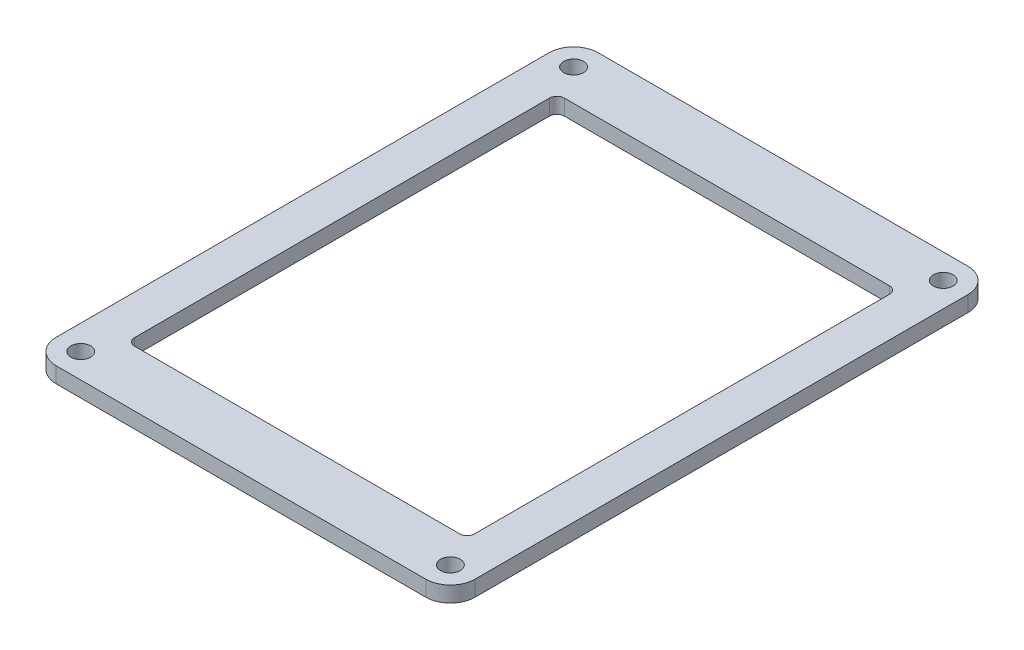
ISO-10303-21;
HEADER;
FILE_DESCRIPTION(('STEP AP214'),'2;1');
FILE_NAME('part.step','',(''),(''),'','','');
FILE_SCHEMA(('AUTOMOTIVE_DESIGN { 1 0 10303 214 1 1 1 1 }'));
ENDSEC;
DATA;
#1=APPLICATION_CONTEXT('core data for automotive mechanical design processes');
#2=APPLICATION_PROTOCOL_DEFINITION('international standard','automotive_design',2000,#1);
#3=PRODUCT_CONTEXT('',#1,'mechanical');
#4=PRODUCT('Part','Part','',(#3));
#5=PRODUCT_RELATED_PRODUCT_CATEGORY('part','',(#4));
#6=PRODUCT_DEFINITION_FORMATION('','',#4);
#7=PRODUCT_DEFINITION_CONTEXT('part definition',#1,'design');
#8=PRODUCT_DEFINITION('design','',#6,#7);
#9=PRODUCT_DEFINITION_SHAPE('','',#8);
#10=(LENGTH_UNIT() NAMED_UNIT(*) SI_UNIT(.MILLI.,.METRE.));
#11=(NAMED_UNIT(*) PLANE_ANGLE_UNIT() SI_UNIT($,.RADIAN.));
#12=(NAMED_UNIT(*) SI_UNIT($,.STERADIAN.) SOLID_ANGLE_UNIT());
#13=UNCERTAINTY_MEASURE_WITH_UNIT(LENGTH_MEASURE(1.E-05),#10,'distance_accuracy_value','');
#14=(GEOMETRIC_REPRESENTATION_CONTEXT(3) GLOBAL_UNCERTAINTY_ASSIGNED_CONTEXT((#13)) GLOBAL_UNIT_ASSIGNED_CONTEXT((#10,
#11,#12)) REPRESENTATION_CONTEXT('',''));
#15=CARTESIAN_POINT('',(0.,0.,0.));
#16=DIRECTION('',(0.,0.,1.));
#17=DIRECTION('',(1.,0.,0.));
#18=AXIS2_PLACEMENT_3D('',#15,#16,#17);
#19=CARTESIAN_POINT('',(0.,3.175,0.));
#20=DIRECTION('',(1.,0.,0.));
#21=DIRECTION('',(0.,0.,-1.));
#22=AXIS2_PLACEMENT_3D('',#19,#20,#21);
#23=PLANE('',#22);
#24=DIRECTION('',(0.,0.,1.));
#25=VECTOR('',#24,1.);
#26=CARTESIAN_POINT('',(0.,3.175,0.));
#27=LINE('',#26,#25);
#28=CARTESIAN_POINT('',(0.,3.175,-105.));
#29=VERTEX_POINT('',#28);
#30=CARTESIAN_POINT('',(0.,3.175,-5.));
#31=VERTEX_POINT('',#30);
#32=EDGE_CURVE('E215',#29,#31,#27,.T.);
#33=ORIENTED_EDGE('',*,*,#32,.F.);
#34=DIRECTION('',(0.,-1.,0.));
#35=VECTOR('',#34,1.);
#36=CARTESIAN_POINT('',(0.,3.175,-105.));
#37=LINE('',#36,#35);
#38=CARTESIAN_POINT('',(0.,0.,-105.));
#39=VERTEX_POINT('',#38);
#40=EDGE_CURVE('E199',#29,#39,#37,.T.);
#41=ORIENTED_EDGE('',*,*,#40,.T.);
#42=DIRECTION('',(0.,0.,1.));
#43=VECTOR('',#42,1.);
#44=CARTESIAN_POINT('',(0.,0.,0.));
#45=LINE('',#44,#43);
#46=CARTESIAN_POINT('',(0.,0.,-5.));
#47=VERTEX_POINT('',#46);
#48=EDGE_CURVE('E212',#39,#47,#45,.T.);
#49=ORIENTED_EDGE('',*,*,#48,.T.);
#50=DIRECTION('',(0.,-1.,0.));
#51=VECTOR('',#50,1.);
#52=CARTESIAN_POINT('',(0.,3.175,-5.));
#53=LINE('',#52,#51);
#54=EDGE_CURVE('E218',#47,#31,#53,.F.);
#55=ORIENTED_EDGE('',*,*,#54,.T.);
#56=EDGE_LOOP('',(#33,#41,#49,#55));
#57=FACE_BOUND('',#56,.T.);
#58=ADVANCED_FACE('F48',(#57),#23,.F.);
#59=CARTESIAN_POINT('',(0.,3.175,0.));
#60=DIRECTION('',(0.,0.,-1.));
#61=DIRECTION('',(-1.,0.,0.));
#62=AXIS2_PLACEMENT_3D('',#59,#60,#61);
#63=PLANE('',#62);
#64=DIRECTION('',(1.,0.,0.));
#65=VECTOR('',#64,1.);
#66=CARTESIAN_POINT('',(0.,3.175,0.));
#67=LINE('',#66,#65);
#68=CARTESIAN_POINT('',(5.,3.175,0.));
#69=VERTEX_POINT('',#68);
#70=CARTESIAN_POINT('',(80.,3.175,0.));
#71=VERTEX_POINT('',#70);
#72=EDGE_CURVE('E370',#69,#71,#67,.T.);
#73=ORIENTED_EDGE('',*,*,#72,.F.);
#74=DIRECTION('',(0.,-1.,0.));
#75=VECTOR('',#74,1.);
#76=CARTESIAN_POINT('',(5.,3.175,0.));
#77=LINE('',#76,#75);
#78=CARTESIAN_POINT('',(5.,0.,0.));
#79=VERTEX_POINT('',#78);
#80=EDGE_CURVE('E282',#69,#79,#77,.T.);
#81=ORIENTED_EDGE('',*,*,#80,.T.);
#82=DIRECTION('',(1.,0.,0.));
#83=VECTOR('',#82,1.);
#84=CARTESIAN_POINT('',(0.,0.,0.));
#85=LINE('',#84,#83);
#86=CARTESIAN_POINT('',(80.,0.,0.));
#87=VERTEX_POINT('',#86);
#88=EDGE_CURVE('E224',#79,#87,#85,.T.);
#89=ORIENTED_EDGE('',*,*,#88,.T.);
#90=DIRECTION('',(0.,-1.,0.));
#91=VECTOR('',#90,1.);
#92=CARTESIAN_POINT('',(80.,3.175,0.));
#93=LINE('',#92,#91);
#94=EDGE_CURVE('E279',#87,#71,#93,.F.);
#95=ORIENTED_EDGE('',*,*,#94,.T.);
#96=EDGE_LOOP('',(#73,#81,#89,#95));
#97=FACE_BOUND('',#96,.T.);
#98=ADVANCED_FACE('F397',(#97),#63,.F.);
#99=CARTESIAN_POINT('',(85.,3.175,0.));
#100=DIRECTION('',(-1.,0.,0.));
#101=DIRECTION('',(0.,0.,1.));
#102=AXIS2_PLACEMENT_3D('',#99,#100,#101);
#103=PLANE('',#102);
#104=DIRECTION('',(0.,0.,-1.));
#105=VECTOR('',#104,1.);
#106=CARTESIAN_POINT('',(85.,0.,0.));
#107=LINE('',#106,#105);
#108=CARTESIAN_POINT('',(85.,0.,-5.));
#109=VERTEX_POINT('',#108);
#110=CARTESIAN_POINT('',(85.,0.,-105.));
#111=VERTEX_POINT('',#110);
#112=EDGE_CURVE('E231',#109,#111,#107,.T.);
#113=ORIENTED_EDGE('',*,*,#112,.T.);
#114=DIRECTION('',(0.,-1.,0.));
#115=VECTOR('',#114,1.);
#116=CARTESIAN_POINT('',(85.,3.175,-105.));
#117=LINE('',#116,#115);
#118=CARTESIAN_POINT('',(85.,3.175,-105.));
#119=VERTEX_POINT('',#118);
#120=EDGE_CURVE('E276',#111,#119,#117,.F.);
#121=ORIENTED_EDGE('',*,*,#120,.T.);
#122=DIRECTION('',(0.,0.,-1.));
#123=VECTOR('',#122,1.);
#124=CARTESIAN_POINT('',(85.,3.175,0.));
#125=LINE('',#124,#123);
#126=CARTESIAN_POINT('',(85.,3.175,-5.));
#127=VERTEX_POINT('',#126);
#128=EDGE_CURVE('E373',#127,#119,#125,.T.);
#129=ORIENTED_EDGE('',*,*,#128,.F.);
#130=DIRECTION('',(0.,-1.,0.));
#131=VECTOR('',#130,1.);
#132=CARTESIAN_POINT('',(85.,3.175,-5.));
#133=LINE('',#132,#131);
#134=EDGE_CURVE('E272',#127,#109,#133,.T.);
#135=ORIENTED_EDGE('',*,*,#134,.T.);
#136=EDGE_LOOP('',(#113,#121,#129,#135));
#137=FACE_BOUND('',#136,.T.);
#138=ADVANCED_FACE('F389',(#137),#103,.F.);
#139=CARTESIAN_POINT('',(0.,3.175,-110.));
#140=DIRECTION('',(0.,0.,1.));
#141=DIRECTION('',(1.,0.,0.));
#142=AXIS2_PLACEMENT_3D('',#139,#140,#141);
#143=PLANE('',#142);
#144=DIRECTION('',(-1.,0.,0.));
#145=VECTOR('',#144,1.);
#146=CARTESIAN_POINT('',(0.,0.,-110.));
#147=LINE('',#146,#145);
#148=CARTESIAN_POINT('',(80.,0.,-110.));
#149=VERTEX_POINT('',#148);
#150=CARTESIAN_POINT('',(5.,0.,-110.));
#151=VERTEX_POINT('',#150);
#152=EDGE_CURVE('E244',#149,#151,#147,.T.);
#153=ORIENTED_EDGE('',*,*,#152,.T.);
#154=DIRECTION('',(0.,-1.,0.));
#155=VECTOR('',#154,1.);
#156=CARTESIAN_POINT('',(5.,3.175,-110.));
#157=LINE('',#156,#155);
#158=CARTESIAN_POINT('',(5.,3.175,-110.));
#159=VERTEX_POINT('',#158);
#160=EDGE_CURVE('E200',#151,#159,#157,.F.);
#161=ORIENTED_EDGE('',*,*,#160,.T.);
#162=DIRECTION('',(-1.,0.,0.));
#163=VECTOR('',#162,1.);
#164=CARTESIAN_POINT('',(0.,3.175,-110.));
#165=LINE('',#164,#163);
#166=CARTESIAN_POINT('',(80.,3.175,-110.));
#167=VERTEX_POINT('',#166);
#168=EDGE_CURVE('E238',#167,#159,#165,.T.);
#169=ORIENTED_EDGE('',*,*,#168,.F.);
#170=DIRECTION('',(0.,-1.,0.));
#171=VECTOR('',#170,1.);
#172=CARTESIAN_POINT('',(80.,3.175,-110.));
#173=LINE('',#172,#171);
#174=EDGE_CURVE('E206',#167,#149,#173,.T.);
#175=ORIENTED_EDGE('',*,*,#174,.T.);
#176=EDGE_LOOP('',(#153,#161,#169,#175));
#177=FACE_BOUND('',#176,.T.);
#178=ADVANCED_FACE('F383',(#177),#143,.F.);
#179=CARTESIAN_POINT('',(0.,3.175,0.));
#180=DIRECTION('',(0.,-1.,0.));
#181=DIRECTION('',(0.,0.,-1.));
#182=AXIS2_PLACEMENT_3D('',#179,#180,#181);
#183=PLANE('',#182);
#184=CARTESIAN_POINT('',(5.,3.175,-105.));
#185=DIRECTION('',(0.,1.,0.));
#186=DIRECTION('',(0.,0.,1.));
#187=AXIS2_PLACEMENT_3D('',#184,#185,#186);
#188=CIRCLE('',#187,2.);
#189=CARTESIAN_POINT('',(5.,3.175,-103.));
#190=VERTEX_POINT('',#189);
#191=EDGE_CURVE('E710',#190,#190,#188,.T.);
#192=ORIENTED_EDGE('',*,*,#191,.F.);
#193=EDGE_LOOP('',(#192));
#194=FACE_BOUND('',#193,.T.);
#195=CARTESIAN_POINT('',(80.,3.175,-105.));
#196=DIRECTION('',(0.,1.,0.));
#197=DIRECTION('',(0.,0.,1.));
#198=AXIS2_PLACEMENT_3D('',#195,#196,#197);
#199=CIRCLE('',#198,2.);
#200=CARTESIAN_POINT('',(80.,3.175,-103.));
#201=VERTEX_POINT('',#200);
#202=EDGE_CURVE('E716',#201,#201,#199,.T.);
#203=ORIENTED_EDGE('',*,*,#202,.F.);
#204=EDGE_LOOP('',(#203));
#205=FACE_BOUND('',#204,.T.);
#206=CARTESIAN_POINT('',(80.,3.175,-5.));
#207=DIRECTION('',(0.,1.,0.));
#208=DIRECTION('',(0.,0.,1.));
#209=AXIS2_PLACEMENT_3D('',#206,#207,#208);
#210=CIRCLE('',#209,2.);
#211=CARTESIAN_POINT('',(80.,3.175,-3.));
#212=VERTEX_POINT('',#211);
#213=EDGE_CURVE('E728',#212,#212,#210,.T.);
#214=ORIENTED_EDGE('',*,*,#213,.F.);
#215=EDGE_LOOP('',(#214));
#216=FACE_BOUND('',#215,.T.);
#217=CARTESIAN_POINT('',(5.,3.175,-5.));
#218=DIRECTION('',(0.,1.,0.));
#219=DIRECTION('',(0.,0.,1.));
#220=AXIS2_PLACEMENT_3D('',#217,#218,#219);
#221=CIRCLE('',#220,2.);
#222=CARTESIAN_POINT('',(5.,3.175,-3.));
#223=VERTEX_POINT('',#222);
#224=EDGE_CURVE('E725',#223,#223,#221,.T.);
#225=ORIENTED_EDGE('',*,*,#224,.F.);
#226=EDGE_LOOP('',(#225));
#227=FACE_BOUND('',#226,.T.);
#228=DIRECTION('',(-1.,0.,0.));
#229=VECTOR('',#228,1.);
#230=CARTESIAN_POINT('',(76.991,3.175,-98.6019999999999));
#231=LINE('',#230,#229);
#232=CARTESIAN_POINT('',(75.491,3.175,-98.6019999999999));
#233=VERTEX_POINT('',#232);
#234=CARTESIAN_POINT('',(9.50899999999996,3.175,-98.6019999999999));
#235=VERTEX_POINT('',#234);
#236=EDGE_CURVE('E336',#233,#235,#231,.T.);
#237=ORIENTED_EDGE('',*,*,#236,.F.);
#238=CARTESIAN_POINT('',(75.491,3.175,-97.1019999999999));
#239=DIRECTION('',(0.,-1.,0.));
#240=DIRECTION('',(0.,0.,-1.));
#241=AXIS2_PLACEMENT_3D('',#238,#239,#240);
#242=CIRCLE('',#241,1.5);
#243=CARTESIAN_POINT('',(76.991,3.175,-97.1019999999999));
#244=VERTEX_POINT('',#243);
#245=EDGE_CURVE('E324',#233,#244,#242,.T.);
#246=ORIENTED_EDGE('',*,*,#245,.T.);
#247=DIRECTION('',(0.,0.,-1.));
#248=VECTOR('',#247,1.);
#249=CARTESIAN_POINT('',(76.991,3.175,-11.398));
#250=LINE('',#249,#248);
#251=CARTESIAN_POINT('',(76.991,3.175,-12.898));
#252=VERTEX_POINT('',#251);
#253=EDGE_CURVE('E343',#252,#244,#250,.T.);
#254=ORIENTED_EDGE('',*,*,#253,.F.);
#255=CARTESIAN_POINT('',(75.491,3.175,-12.898));
#256=DIRECTION('',(0.,-1.,0.));
#257=DIRECTION('',(0.,0.,-1.));
#258=AXIS2_PLACEMENT_3D('',#255,#256,#257);
#259=CIRCLE('',#258,1.5);
#260=CARTESIAN_POINT('',(75.491,3.175,-11.398));
#261=VERTEX_POINT('',#260);
#262=EDGE_CURVE('E312',#252,#261,#259,.T.);
#263=ORIENTED_EDGE('',*,*,#262,.T.);
#264=DIRECTION('',(1.,0.,0.));
#265=VECTOR('',#264,1.);
#266=CARTESIAN_POINT('',(76.991,3.175,-11.398));
#267=LINE('',#266,#265);
#268=CARTESIAN_POINT('',(9.50899999999999,3.175,-11.398));
#269=VERTEX_POINT('',#268);
#270=EDGE_CURVE('E365',#269,#261,#267,.T.);
#271=ORIENTED_EDGE('',*,*,#270,.F.);
#272=CARTESIAN_POINT('',(9.50899999999999,3.175,-12.898));
#273=DIRECTION('',(0.,-1.,0.));
#274=DIRECTION('',(0.,0.,-1.));
#275=AXIS2_PLACEMENT_3D('',#272,#273,#274);
#276=CIRCLE('',#275,1.5);
#277=CARTESIAN_POINT('',(8.00899999999999,3.175,-12.898));
#278=VERTEX_POINT('',#277);
#279=EDGE_CURVE('E318',#269,#278,#276,.T.);
#280=ORIENTED_EDGE('',*,*,#279,.T.);
#281=DIRECTION('',(0.,0.,1.));
#282=VECTOR('',#281,1.);
#283=CARTESIAN_POINT('',(8.00899999999999,3.175,-11.398));
#284=LINE('',#283,#282);
#285=CARTESIAN_POINT('',(8.00899999999997,3.175,-97.1019999999999));
#286=VERTEX_POINT('',#285);
#287=EDGE_CURVE('E338',#286,#278,#284,.T.);
#288=ORIENTED_EDGE('',*,*,#287,.F.);
#289=CARTESIAN_POINT('',(9.50899999999997,3.175,-97.1019999999999));
#290=DIRECTION('',(0.,-1.,0.));
#291=DIRECTION('',(0.,0.,-1.));
#292=AXIS2_PLACEMENT_3D('',#289,#290,#291);
#293=CIRCLE('',#292,1.5);
#294=EDGE_CURVE('E57',#286,#235,#293,.T.);
#295=ORIENTED_EDGE('',*,*,#294,.T.);
#296=EDGE_LOOP('',(#237,#246,#254,#263,#271,#280,#288,#295));
#297=FACE_BOUND('',#296,.T.);
#298=ORIENTED_EDGE('',*,*,#168,.T.);
#299=CARTESIAN_POINT('',(5.,3.175,-105.));
#300=DIRECTION('',(0.,-1.,0.));
#301=DIRECTION('',(0.,0.,-1.));
#302=AXIS2_PLACEMENT_3D('',#299,#300,#301);
#303=CIRCLE('',#302,5.);
#304=EDGE_CURVE('E269',#159,#29,#303,.F.);
#305=ORIENTED_EDGE('',*,*,#304,.T.);
#306=ORIENTED_EDGE('',*,*,#32,.T.);
#307=CARTESIAN_POINT('',(5.,3.175,-5.));
#308=DIRECTION('',(0.,-1.,0.));
#309=DIRECTION('',(0.,0.,-1.));
#310=AXIS2_PLACEMENT_3D('',#307,#308,#309);
#311=CIRCLE('',#310,5.);
#312=EDGE_CURVE('E263',#31,#69,#311,.F.);
#313=ORIENTED_EDGE('',*,*,#312,.T.);
#314=ORIENTED_EDGE('',*,*,#72,.T.);
#315=CARTESIAN_POINT('',(80.,3.175,-5.));
#316=DIRECTION('',(0.,-1.,0.));
#317=DIRECTION('',(0.,0.,-1.));
#318=AXIS2_PLACEMENT_3D('',#315,#316,#317);
#319=CIRCLE('',#318,5.);
#320=EDGE_CURVE('E260',#71,#127,#319,.F.);
#321=ORIENTED_EDGE('',*,*,#320,.T.);
#322=ORIENTED_EDGE('',*,*,#128,.T.);
#323=CARTESIAN_POINT('',(80.,3.175,-105.));
#324=DIRECTION('',(0.,-1.,0.));
#325=DIRECTION('',(0.,0.,-1.));
#326=AXIS2_PLACEMENT_3D('',#323,#324,#325);
#327=CIRCLE('',#326,5.);
#328=EDGE_CURVE('E266',#119,#167,#327,.F.);
#329=ORIENTED_EDGE('',*,*,#328,.T.);
#330=EDGE_LOOP('',(#298,#305,#306,#313,#314,#321,#322,#329));
#331=FACE_BOUND('',#330,.T.);
#332=ADVANCED_FACE('F334',(#194,#205,#216,#227,#297,#331),#183,.F.);
#333=CARTESIAN_POINT('',(0.,0.,0.));
#334=DIRECTION('',(0.,-1.,0.));
#335=DIRECTION('',(0.,0.,-1.));
#336=AXIS2_PLACEMENT_3D('',#333,#334,#335);
#337=PLANE('',#336);
#338=CARTESIAN_POINT('',(5.,0.,-105.));
#339=DIRECTION('',(0.,1.,0.));
#340=DIRECTION('',(0.,0.,1.));
#341=AXIS2_PLACEMENT_3D('',#338,#339,#340);
#342=CIRCLE('',#341,2.);
#343=CARTESIAN_POINT('',(5.,0.,-103.));
#344=VERTEX_POINT('',#343);
#345=EDGE_CURVE('E707',#344,#344,#342,.T.);
#346=ORIENTED_EDGE('',*,*,#345,.T.);
#347=EDGE_LOOP('',(#346));
#348=FACE_BOUND('',#347,.T.);
#349=CARTESIAN_POINT('',(80.,0.,-105.));
#350=DIRECTION('',(0.,1.,0.));
#351=DIRECTION('',(0.,0.,1.));
#352=AXIS2_PLACEMENT_3D('',#349,#350,#351);
#353=CIRCLE('',#352,2.);
#354=CARTESIAN_POINT('',(80.,0.,-103.));
#355=VERTEX_POINT('',#354);
#356=EDGE_CURVE('E712',#355,#355,#353,.T.);
#357=ORIENTED_EDGE('',*,*,#356,.T.);
#358=EDGE_LOOP('',(#357));
#359=FACE_BOUND('',#358,.T.);
#360=CARTESIAN_POINT('',(80.,0.,-5.));
#361=DIRECTION('',(0.,1.,0.));
#362=DIRECTION('',(0.,0.,1.));
#363=AXIS2_PLACEMENT_3D('',#360,#361,#362);
#364=CIRCLE('',#363,2.);
#365=CARTESIAN_POINT('',(80.,0.,-3.));
#366=VERTEX_POINT('',#365);
#367=EDGE_CURVE('E743',#366,#366,#364,.T.);
#368=ORIENTED_EDGE('',*,*,#367,.T.);
#369=EDGE_LOOP('',(#368));
#370=FACE_BOUND('',#369,.T.);
#371=CARTESIAN_POINT('',(5.,0.,-5.));
#372=DIRECTION('',(0.,1.,0.));
#373=DIRECTION('',(0.,0.,1.));
#374=AXIS2_PLACEMENT_3D('',#371,#372,#373);
#375=CIRCLE('',#374,2.);
#376=CARTESIAN_POINT('',(5.,0.,-3.));
#377=VERTEX_POINT('',#376);
#378=EDGE_CURVE('E362',#377,#377,#375,.T.);
#379=ORIENTED_EDGE('',*,*,#378,.T.);
#380=EDGE_LOOP('',(#379));
#381=FACE_BOUND('',#380,.T.);
#382=DIRECTION('',(1.,0.,0.));
#383=VECTOR('',#382,1.);
#384=CARTESIAN_POINT('',(76.991,0.,-11.398));
#385=LINE('',#384,#383);
#386=CARTESIAN_POINT('',(9.50899999999999,0.,-11.398));
#387=VERTEX_POINT('',#386);
#388=CARTESIAN_POINT('',(75.491,0.,-11.398));
#389=VERTEX_POINT('',#388);
#390=EDGE_CURVE('E225',#387,#389,#385,.T.);
#391=ORIENTED_EDGE('',*,*,#390,.T.);
#392=CARTESIAN_POINT('',(75.491,0.,-12.898));
#393=DIRECTION('',(0.,-1.,0.));
#394=DIRECTION('',(0.,0.,-1.));
#395=AXIS2_PLACEMENT_3D('',#392,#393,#394);
#396=CIRCLE('',#395,1.5);
#397=CARTESIAN_POINT('',(76.991,0.,-12.898));
#398=VERTEX_POINT('',#397);
#399=EDGE_CURVE('E315',#389,#398,#396,.F.);
#400=ORIENTED_EDGE('',*,*,#399,.T.);
#401=DIRECTION('',(0.,0.,-1.));
#402=VECTOR('',#401,1.);
#403=CARTESIAN_POINT('',(76.991,0.,-11.398));
#404=LINE('',#403,#402);
#405=CARTESIAN_POINT('',(76.991,0.,-97.1019999999999));
#406=VERTEX_POINT('',#405);
#407=EDGE_CURVE('E356',#398,#406,#404,.T.);
#408=ORIENTED_EDGE('',*,*,#407,.T.);
#409=CARTESIAN_POINT('',(75.491,0.,-97.1019999999999));
#410=DIRECTION('',(0.,-1.,0.));
#411=DIRECTION('',(0.,0.,-1.));
#412=AXIS2_PLACEMENT_3D('',#409,#410,#411);
#413=CIRCLE('',#412,1.5);
#414=CARTESIAN_POINT('',(75.491,0.,-98.6019999999999));
#415=VERTEX_POINT('',#414);
#416=EDGE_CURVE('E77',#406,#415,#413,.F.);
#417=ORIENTED_EDGE('',*,*,#416,.T.);
#418=DIRECTION('',(-1.,0.,0.));
#419=VECTOR('',#418,1.);
#420=CARTESIAN_POINT('',(76.991,0.,-98.6019999999999));
#421=LINE('',#420,#419);
#422=CARTESIAN_POINT('',(9.50899999999996,0.,-98.6019999999999));
#423=VERTEX_POINT('',#422);
#424=EDGE_CURVE('E349',#415,#423,#421,.T.);
#425=ORIENTED_EDGE('',*,*,#424,.T.);
#426=CARTESIAN_POINT('',(9.50899999999997,0.,-97.1019999999999));
#427=DIRECTION('',(0.,-1.,0.));
#428=DIRECTION('',(0.,0.,-1.));
#429=AXIS2_PLACEMENT_3D('',#426,#427,#428);
#430=CIRCLE('',#429,1.5);
#431=CARTESIAN_POINT('',(8.00899999999997,0.,-97.1019999999999));
#432=VERTEX_POINT('',#431);
#433=EDGE_CURVE('E11',#423,#432,#430,.F.);
#434=ORIENTED_EDGE('',*,*,#433,.T.);
#435=DIRECTION('',(0.,0.,1.));
#436=VECTOR('',#435,1.);
#437=CARTESIAN_POINT('',(8.00899999999999,0.,-11.398));
#438=LINE('',#437,#436);
#439=CARTESIAN_POINT('',(8.00899999999999,0.,-12.898));
#440=VERTEX_POINT('',#439);
#441=EDGE_CURVE('E235',#432,#440,#438,.T.);
#442=ORIENTED_EDGE('',*,*,#441,.T.);
#443=CARTESIAN_POINT('',(9.50899999999999,0.,-12.898));
#444=DIRECTION('',(0.,-1.,0.));
#445=DIRECTION('',(0.,0.,-1.));
#446=AXIS2_PLACEMENT_3D('',#443,#444,#445);
#447=CIRCLE('',#446,1.5);
#448=EDGE_CURVE('E321',#440,#387,#447,.F.);
#449=ORIENTED_EDGE('',*,*,#448,.T.);
#450=EDGE_LOOP('',(#391,#400,#408,#417,#425,#434,#442,#449));
#451=FACE_BOUND('',#450,.T.);
#452=ORIENTED_EDGE('',*,*,#48,.F.);
#453=CARTESIAN_POINT('',(5.,0.,-105.));
#454=DIRECTION('',(0.,-1.,0.));
#455=DIRECTION('',(0.,0.,-1.));
#456=AXIS2_PLACEMENT_3D('',#453,#454,#455);
#457=CIRCLE('',#456,5.);
#458=EDGE_CURVE('E195',#39,#151,#457,.T.);
#459=ORIENTED_EDGE('',*,*,#458,.T.);
#460=ORIENTED_EDGE('',*,*,#152,.F.);
#461=CARTESIAN_POINT('',(80.,0.,-105.));
#462=DIRECTION('',(0.,-1.,0.));
#463=DIRECTION('',(0.,0.,-1.));
#464=AXIS2_PLACEMENT_3D('',#461,#462,#463);
#465=CIRCLE('',#464,5.);
#466=EDGE_CURVE('E207',#149,#111,#465,.T.);
#467=ORIENTED_EDGE('',*,*,#466,.T.);
#468=ORIENTED_EDGE('',*,*,#112,.F.);
#469=CARTESIAN_POINT('',(80.,0.,-5.));
#470=DIRECTION('',(0.,-1.,0.));
#471=DIRECTION('',(0.,0.,-1.));
#472=AXIS2_PLACEMENT_3D('',#469,#470,#471);
#473=CIRCLE('',#472,5.);
#474=EDGE_CURVE('E217',#109,#87,#473,.T.);
#475=ORIENTED_EDGE('',*,*,#474,.T.);
#476=ORIENTED_EDGE('',*,*,#88,.F.);
#477=CARTESIAN_POINT('',(5.,0.,-5.));
#478=DIRECTION('',(0.,-1.,0.));
#479=DIRECTION('',(0.,0.,-1.));
#480=AXIS2_PLACEMENT_3D('',#477,#478,#479);
#481=CIRCLE('',#480,5.);
#482=EDGE_CURVE('E222',#79,#47,#481,.T.);
#483=ORIENTED_EDGE('',*,*,#482,.T.);
#484=EDGE_LOOP('',(#452,#459,#460,#467,#468,#475,#476,#483));
#485=FACE_BOUND('',#484,.T.);
#486=ADVANCED_FACE('F220',(#348,#359,#370,#381,#451,#485),#337,.T.);
#487=CARTESIAN_POINT('',(5.,3.175,-105.));
#488=DIRECTION('',(0.,-1.,0.));
#489=DIRECTION('',(0.,0.,-1.));
#490=AXIS2_PLACEMENT_3D('',#487,#488,#489);
#491=CYLINDRICAL_SURFACE('',#490,5.);
#492=ORIENTED_EDGE('',*,*,#304,.F.);
#493=ORIENTED_EDGE('',*,*,#160,.F.);
#494=ORIENTED_EDGE('',*,*,#458,.F.);
#495=ORIENTED_EDGE('',*,*,#40,.F.);
#496=EDGE_LOOP('',(#492,#493,#494,#495));
#497=FACE_BOUND('',#496,.T.);
#498=ADVANCED_FACE('F198',(#497),#491,.T.);
#499=CARTESIAN_POINT('',(80.,3.175,-105.));
#500=DIRECTION('',(0.,-1.,0.));
#501=DIRECTION('',(0.,0.,-1.));
#502=AXIS2_PLACEMENT_3D('',#499,#500,#501);
#503=CYLINDRICAL_SURFACE('',#502,5.);
#504=ORIENTED_EDGE('',*,*,#328,.F.);
#505=ORIENTED_EDGE('',*,*,#120,.F.);
#506=ORIENTED_EDGE('',*,*,#466,.F.);
#507=ORIENTED_EDGE('',*,*,#174,.F.);
#508=EDGE_LOOP('',(#504,#505,#506,#507));
#509=FACE_BOUND('',#508,.T.);
#510=ADVANCED_FACE('F385',(#509),#503,.T.);
#511=CARTESIAN_POINT('',(5.,3.175,-5.));
#512=DIRECTION('',(0.,-1.,0.));
#513=DIRECTION('',(0.,0.,-1.));
#514=AXIS2_PLACEMENT_3D('',#511,#512,#513);
#515=CYLINDRICAL_SURFACE('',#514,5.);
#516=ORIENTED_EDGE('',*,*,#312,.F.);
#517=ORIENTED_EDGE('',*,*,#54,.F.);
#518=ORIENTED_EDGE('',*,*,#482,.F.);
#519=ORIENTED_EDGE('',*,*,#80,.F.);
#520=EDGE_LOOP('',(#516,#517,#518,#519));
#521=FACE_BOUND('',#520,.T.);
#522=ADVANCED_FACE('F401',(#521),#515,.T.);
#523=CARTESIAN_POINT('',(80.,3.175,-5.));
#524=DIRECTION('',(0.,-1.,0.));
#525=DIRECTION('',(0.,0.,-1.));
#526=AXIS2_PLACEMENT_3D('',#523,#524,#525);
#527=CYLINDRICAL_SURFACE('',#526,5.);
#528=ORIENTED_EDGE('',*,*,#320,.F.);
#529=ORIENTED_EDGE('',*,*,#94,.F.);
#530=ORIENTED_EDGE('',*,*,#474,.F.);
#531=ORIENTED_EDGE('',*,*,#134,.F.);
#532=EDGE_LOOP('',(#528,#529,#530,#531));
#533=FACE_BOUND('',#532,.T.);
#534=ADVANCED_FACE('F393',(#533),#527,.T.);
#535=CARTESIAN_POINT('',(76.991,0.,-11.398));
#536=DIRECTION('',(1.,0.,0.));
#537=DIRECTION('',(0.,0.,-1.));
#538=AXIS2_PLACEMENT_3D('',#535,#536,#537);
#539=PLANE('',#538);
#540=ORIENTED_EDGE('',*,*,#407,.F.);
#541=DIRECTION('',(0.,1.,0.));
#542=VECTOR('',#541,1.);
#543=CARTESIAN_POINT('',(76.991,3.175,-12.898));
#544=LINE('',#543,#542);
#545=EDGE_CURVE('E289',#398,#252,#544,.T.);
#546=ORIENTED_EDGE('',*,*,#545,.T.);
#547=ORIENTED_EDGE('',*,*,#253,.T.);
#548=DIRECTION('',(0.,1.,0.));
#549=VECTOR('',#548,1.);
#550=CARTESIAN_POINT('',(76.991,0.,-97.1019999999999));
#551=LINE('',#550,#549);
#552=EDGE_CURVE('E286',#244,#406,#551,.F.);
#553=ORIENTED_EDGE('',*,*,#552,.T.);
#554=EDGE_LOOP('',(#540,#546,#547,#553));
#555=FACE_BOUND('',#554,.T.);
#556=ADVANCED_FACE('F408',(#555),#539,.F.);
#557=CARTESIAN_POINT('',(76.991,0.,-11.398));
#558=DIRECTION('',(0.,0.,1.));
#559=DIRECTION('',(1.,0.,0.));
#560=AXIS2_PLACEMENT_3D('',#557,#558,#559);
#561=PLANE('',#560);
#562=ORIENTED_EDGE('',*,*,#270,.T.);
#563=DIRECTION('',(0.,1.,0.));
#564=VECTOR('',#563,1.);
#565=CARTESIAN_POINT('',(75.491,0.,-11.398));
#566=LINE('',#565,#564);
#567=EDGE_CURVE('E297',#261,#389,#566,.F.);
#568=ORIENTED_EDGE('',*,*,#567,.T.);
#569=ORIENTED_EDGE('',*,*,#390,.F.);
#570=DIRECTION('',(0.,1.,0.));
#571=VECTOR('',#570,1.);
#572=CARTESIAN_POINT('',(9.50899999999999,3.175,-11.398));
#573=LINE('',#572,#571);
#574=EDGE_CURVE('E293',#387,#269,#573,.T.);
#575=ORIENTED_EDGE('',*,*,#574,.T.);
#576=EDGE_LOOP('',(#562,#568,#569,#575));
#577=FACE_BOUND('',#576,.T.);
#578=ADVANCED_FACE('F480',(#577),#561,.F.);
#579=CARTESIAN_POINT('',(8.00899999999999,0.,-11.398));
#580=DIRECTION('',(-1.,0.,0.));
#581=DIRECTION('',(0.,0.,1.));
#582=AXIS2_PLACEMENT_3D('',#579,#580,#581);
#583=PLANE('',#582);
#584=ORIENTED_EDGE('',*,*,#287,.T.);
#585=DIRECTION('',(0.,1.,0.));
#586=VECTOR('',#585,1.);
#587=CARTESIAN_POINT('',(8.00899999999999,0.,-12.898));
#588=LINE('',#587,#586);
#589=EDGE_CURVE('E303',#278,#440,#588,.F.);
#590=ORIENTED_EDGE('',*,*,#589,.T.);
#591=ORIENTED_EDGE('',*,*,#441,.F.);
#592=DIRECTION('',(0.,1.,0.));
#593=VECTOR('',#592,1.);
#594=CARTESIAN_POINT('',(8.00899999999997,3.175,-97.1019999999999));
#595=LINE('',#594,#593);
#596=EDGE_CURVE('E300',#432,#286,#595,.T.);
#597=ORIENTED_EDGE('',*,*,#596,.T.);
#598=EDGE_LOOP('',(#584,#590,#591,#597));
#599=FACE_BOUND('',#598,.T.);
#600=ADVANCED_FACE('F351',(#599),#583,.F.);
#601=CARTESIAN_POINT('',(76.991,0.,-98.6019999999999));
#602=DIRECTION('',(0.,0.,-1.));
#603=DIRECTION('',(-1.,0.,0.));
#604=AXIS2_PLACEMENT_3D('',#601,#602,#603);
#605=PLANE('',#604);
#606=ORIENTED_EDGE('',*,*,#424,.F.);
#607=DIRECTION('',(0.,1.,0.));
#608=VECTOR('',#607,1.);
#609=CARTESIAN_POINT('',(75.491,3.175,-98.6019999999999));
#610=LINE('',#609,#608);
#611=EDGE_CURVE('E308',#415,#233,#610,.T.);
#612=ORIENTED_EDGE('',*,*,#611,.T.);
#613=ORIENTED_EDGE('',*,*,#236,.T.);
#614=DIRECTION('',(0.,1.,0.));
#615=VECTOR('',#614,1.);
#616=CARTESIAN_POINT('',(9.50899999999997,0.,-98.6019999999999));
#617=LINE('',#616,#615);
#618=EDGE_CURVE('E67',#235,#423,#617,.F.);
#619=ORIENTED_EDGE('',*,*,#618,.T.);
#620=EDGE_LOOP('',(#606,#612,#613,#619));
#621=FACE_BOUND('',#620,.T.);
#622=ADVANCED_FACE('F341',(#621),#605,.F.);
#623=CARTESIAN_POINT('',(75.491,0.,-12.898));
#624=DIRECTION('',(0.,-1.,0.));
#625=DIRECTION('',(0.,0.,-1.));
#626=AXIS2_PLACEMENT_3D('',#623,#624,#625);
#627=CYLINDRICAL_SURFACE('',#626,1.5);
#628=ORIENTED_EDGE('',*,*,#399,.F.);
#629=ORIENTED_EDGE('',*,*,#567,.F.);
#630=ORIENTED_EDGE('',*,*,#262,.F.);
#631=ORIENTED_EDGE('',*,*,#545,.F.);
#632=EDGE_LOOP('',(#628,#629,#630,#631));
#633=FACE_BOUND('',#632,.T.);
#634=ADVANCED_FACE('F505',(#633),#627,.F.);
#635=CARTESIAN_POINT('',(9.50899999999999,0.,-12.898));
#636=DIRECTION('',(0.,-1.,0.));
#637=DIRECTION('',(0.,0.,-1.));
#638=AXIS2_PLACEMENT_3D('',#635,#636,#637);
#639=CYLINDRICAL_SURFACE('',#638,1.5);
#640=ORIENTED_EDGE('',*,*,#448,.F.);
#641=ORIENTED_EDGE('',*,*,#589,.F.);
#642=ORIENTED_EDGE('',*,*,#279,.F.);
#643=ORIENTED_EDGE('',*,*,#574,.F.);
#644=EDGE_LOOP('',(#640,#641,#642,#643));
#645=FACE_BOUND('',#644,.T.);
#646=ADVANCED_FACE('F512',(#645),#639,.F.);
#647=CARTESIAN_POINT('',(75.491,0.,-97.1019999999999));
#648=DIRECTION('',(0.,-1.,0.));
#649=DIRECTION('',(0.,0.,-1.));
#650=AXIS2_PLACEMENT_3D('',#647,#648,#649);
#651=CYLINDRICAL_SURFACE('',#650,1.5);
#652=ORIENTED_EDGE('',*,*,#416,.F.);
#653=ORIENTED_EDGE('',*,*,#552,.F.);
#654=ORIENTED_EDGE('',*,*,#245,.F.);
#655=ORIENTED_EDGE('',*,*,#611,.F.);
#656=EDGE_LOOP('',(#652,#653,#654,#655));
#657=FACE_BOUND('',#656,.T.);
#658=ADVANCED_FACE('F520',(#657),#651,.F.);
#659=CARTESIAN_POINT('',(9.50899999999997,0.,-97.1019999999999));
#660=DIRECTION('',(0.,-1.,0.));
#661=DIRECTION('',(0.,0.,-1.));
#662=AXIS2_PLACEMENT_3D('',#659,#660,#661);
#663=CYLINDRICAL_SURFACE('',#662,1.5);
#664=ORIENTED_EDGE('',*,*,#433,.F.);
#665=ORIENTED_EDGE('',*,*,#618,.F.);
#666=ORIENTED_EDGE('',*,*,#294,.F.);
#667=ORIENTED_EDGE('',*,*,#596,.F.);
#668=EDGE_LOOP('',(#664,#665,#666,#667));
#669=FACE_BOUND('',#668,.T.);
#670=ADVANCED_FACE('F50',(#669),#663,.F.);
#671=CARTESIAN_POINT('',(5.,0.,-5.));
#672=DIRECTION('',(0.,1.,0.));
#673=DIRECTION('',(0.,0.,1.));
#674=AXIS2_PLACEMENT_3D('',#671,#672,#673);
#675=CYLINDRICAL_SURFACE('',#674,2.);
#676=ORIENTED_EDGE('',*,*,#378,.F.);
#677=EDGE_LOOP('',(#676));
#678=FACE_BOUND('',#677,.T.);
#679=ORIENTED_EDGE('',*,*,#224,.T.);
#680=EDGE_LOOP('',(#679));
#681=FACE_BOUND('',#680,.T.);
#682=ADVANCED_FACE('F537',(#678,#681),#675,.F.);
#683=CARTESIAN_POINT('',(80.,0.,-5.));
#684=DIRECTION('',(0.,1.,0.));
#685=DIRECTION('',(0.,0.,1.));
#686=AXIS2_PLACEMENT_3D('',#683,#684,#685);
#687=CYLINDRICAL_SURFACE('',#686,2.);
#688=ORIENTED_EDGE('',*,*,#367,.F.);
#689=EDGE_LOOP('',(#688));
#690=FACE_BOUND('',#689,.T.);
#691=ORIENTED_EDGE('',*,*,#213,.T.);
#692=EDGE_LOOP('',(#691));
#693=FACE_BOUND('',#692,.T.);
#694=ADVANCED_FACE('F544',(#690,#693),#687,.F.);
#695=CARTESIAN_POINT('',(80.,0.,-105.));
#696=DIRECTION('',(0.,1.,0.));
#697=DIRECTION('',(0.,0.,1.));
#698=AXIS2_PLACEMENT_3D('',#695,#696,#697);
#699=CYLINDRICAL_SURFACE('',#698,2.);
#700=ORIENTED_EDGE('',*,*,#356,.F.);
#701=EDGE_LOOP('',(#700));
#702=FACE_BOUND('',#701,.T.);
#703=ORIENTED_EDGE('',*,*,#202,.T.);
#704=EDGE_LOOP('',(#703));
#705=FACE_BOUND('',#704,.T.);
#706=ADVANCED_FACE('F553',(#702,#705),#699,.F.);
#707=CARTESIAN_POINT('',(5.,0.,-105.));
#708=DIRECTION('',(0.,1.,0.));
#709=DIRECTION('',(0.,0.,1.));
#710=AXIS2_PLACEMENT_3D('',#707,#708,#709);
#711=CYLINDRICAL_SURFACE('',#710,2.);
#712=ORIENTED_EDGE('',*,*,#345,.F.);
#713=EDGE_LOOP('',(#712));
#714=FACE_BOUND('',#713,.T.);
#715=ORIENTED_EDGE('',*,*,#191,.T.);
#716=EDGE_LOOP('',(#715));
#717=FACE_BOUND('',#716,.T.);
#718=ADVANCED_FACE('F563',(#714,#717),#711,.F.);
#719=CLOSED_SHELL('',(#58,#98,#138,#178,#332,#486,#498,#510,#522,#534,#556,#578,#600,#622,#634,
#646,#658,#670,#682,#694,#706,#718));
#720=MANIFOLD_SOLID_BREP('B2',#719);
#721=ADVANCED_BREP_SHAPE_REPRESENTATION('',(#18,#720),#14);
#722=SHAPE_DEFINITION_REPRESENTATION(#9,#721);
ENDSEC;
END-ISO-10303-21;
